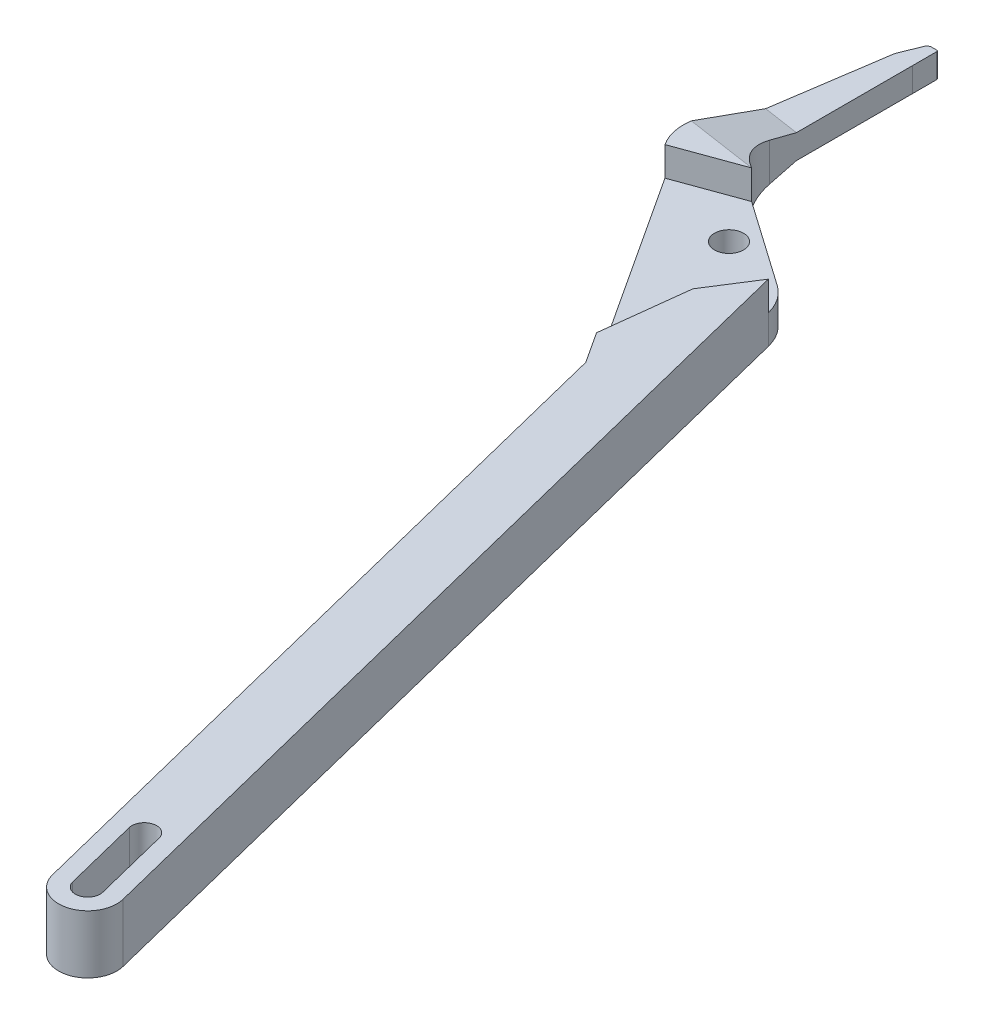
ISO-10303-21;
HEADER;
FILE_DESCRIPTION(('STEP AP214'),'2;1');
FILE_NAME('part.step','',(''),(''),'','','');
FILE_SCHEMA(('AUTOMOTIVE_DESIGN { 1 0 10303 214 1 1 1 1 }'));
ENDSEC;
DATA;
#1=APPLICATION_CONTEXT('core data for automotive mechanical design processes');
#2=APPLICATION_PROTOCOL_DEFINITION('international standard','automotive_design',2000,#1);
#3=PRODUCT_CONTEXT('',#1,'mechanical');
#4=PRODUCT('Part','Part','',(#3));
#5=PRODUCT_RELATED_PRODUCT_CATEGORY('part','',(#4));
#6=PRODUCT_DEFINITION_FORMATION('','',#4);
#7=PRODUCT_DEFINITION_CONTEXT('part definition',#1,'design');
#8=PRODUCT_DEFINITION('design','',#6,#7);
#9=PRODUCT_DEFINITION_SHAPE('','',#8);
#10=(LENGTH_UNIT() NAMED_UNIT(*) SI_UNIT(.MILLI.,.METRE.));
#11=(NAMED_UNIT(*) PLANE_ANGLE_UNIT() SI_UNIT($,.RADIAN.));
#12=(NAMED_UNIT(*) SI_UNIT($,.STERADIAN.) SOLID_ANGLE_UNIT());
#13=UNCERTAINTY_MEASURE_WITH_UNIT(LENGTH_MEASURE(1.E-05),#10,'distance_accuracy_value','');
#14=(GEOMETRIC_REPRESENTATION_CONTEXT(3) GLOBAL_UNCERTAINTY_ASSIGNED_CONTEXT((#13)) GLOBAL_UNIT_ASSIGNED_CONTEXT((#10,
#11,#12)) REPRESENTATION_CONTEXT('',''));
#15=CARTESIAN_POINT('',(0.,0.,0.));
#16=DIRECTION('',(0.,0.,1.));
#17=DIRECTION('',(1.,0.,0.));
#18=AXIS2_PLACEMENT_3D('',#15,#16,#17);
#19=CARTESIAN_POINT('',(-10.,12.,0.));
#20=DIRECTION('',(1.,0.,0.));
#21=DIRECTION('',(0.,0.,-1.));
#22=AXIS2_PLACEMENT_3D('',#19,#20,#21);
#23=PLANE('',#22);
#24=DIRECTION('',(0.,0.,1.));
#25=VECTOR('',#24,1.);
#26=CARTESIAN_POINT('',(-10.,8.5,0.));
#27=LINE('',#26,#25);
#28=CARTESIAN_POINT('',(-10.,8.49999999999999,-52.8559483259043));
#29=VERTEX_POINT('',#28);
#30=CARTESIAN_POINT('',(-10.,8.49999999999999,-47.8559483259043));
#31=VERTEX_POINT('',#30);
#32=EDGE_CURVE('E344',#29,#31,#27,.T.);
#33=ORIENTED_EDGE('',*,*,#32,.T.);
#34=DIRECTION('',(0.,-1.,0.));
#35=VECTOR('',#34,1.);
#36=CARTESIAN_POINT('',(-10.,12.,-47.8559483259043));
#37=LINE('',#36,#35);
#38=CARTESIAN_POINT('',(-10.,3.5,-47.8559483259043));
#39=VERTEX_POINT('',#38);
#40=EDGE_CURVE('E12',#31,#39,#37,.T.);
#41=ORIENTED_EDGE('',*,*,#40,.T.);
#42=DIRECTION('',(0.,0.,1.));
#43=VECTOR('',#42,1.);
#44=CARTESIAN_POINT('',(-10.,3.5,0.));
#45=LINE('',#44,#43);
#46=CARTESIAN_POINT('',(-10.,3.49999999999999,-52.8559483259043));
#47=VERTEX_POINT('',#46);
#48=EDGE_CURVE('E319',#47,#39,#45,.T.);
#49=ORIENTED_EDGE('',*,*,#48,.F.);
#50=DIRECTION('',(0.,-1.,0.));
#51=VECTOR('',#50,1.);
#52=CARTESIAN_POINT('',(-10.,12.,-52.8559483259043));
#53=LINE('',#52,#51);
#54=EDGE_CURVE('E471',#29,#47,#53,.T.);
#55=ORIENTED_EDGE('',*,*,#54,.F.);
#56=EDGE_LOOP('',(#33,#41,#49,#55));
#57=FACE_BOUND('',#56,.T.);
#58=ADVANCED_FACE('F48',(#57),#23,.T.);
#59=CARTESIAN_POINT('',(0.,12.,0.));
#60=DIRECTION('',(0.,1.,0.));
#61=DIRECTION('',(0.,0.,1.));
#62=AXIS2_PLACEMENT_3D('',#59,#60,#61);
#63=PLANE('',#62);
#64=CARTESIAN_POINT('',(55.143940196513,12.,187.354629285445));
#65=DIRECTION('',(0.,1.,0.));
#66=DIRECTION('',(0.,0.,1.));
#67=AXIS2_PLACEMENT_3D('',#64,#65,#66);
#68=CIRCLE('',#67,2.54999999999999);
#69=CARTESIAN_POINT('',(52.6696860945093,12.,187.971530119224));
#70=VERTEX_POINT('',#69);
#71=CARTESIAN_POINT('',(57.6181942985169,12.,186.737728451666));
#72=VERTEX_POINT('',#71);
#73=EDGE_CURVE('E366',#70,#72,#68,.T.);
#74=ORIENTED_EDGE('',*,*,#73,.F.);
#75=DIRECTION('',(-0.241921895599676,0.,-0.970295726275994));
#76=VECTOR('',#75,1.);
#77=CARTESIAN_POINT('',(5.46348532198055,12.,-1.36219988389249));
#78=LINE('',#77,#76);
#79=CARTESIAN_POINT('',(48.7989357649145,12.,172.446798498808));
#80=VERTEX_POINT('',#79);
#81=EDGE_CURVE('E370',#70,#80,#78,.T.);
#82=ORIENTED_EDGE('',*,*,#81,.T.);
#83=CARTESIAN_POINT('',(51.2731898669183,12.,171.829897665029));
#84=DIRECTION('',(0.,1.,0.));
#85=DIRECTION('',(0.,0.,1.));
#86=AXIS2_PLACEMENT_3D('',#83,#84,#85);
#87=CIRCLE('',#86,2.55);
#88=CARTESIAN_POINT('',(53.747443968922,12.,171.21299683125));
#89=VERTEX_POINT('',#88);
#90=EDGE_CURVE('E373',#89,#80,#87,.T.);
#91=ORIENTED_EDGE('',*,*,#90,.F.);
#92=DIRECTION('',(-0.241921895599675,0.,-0.970295726275995));
#93=VECTOR('',#92,1.);
#94=CARTESIAN_POINT('',(10.4119935259884,12.,-2.59600155145089));
#95=LINE('',#94,#93);
#96=EDGE_CURVE('E377',#72,#89,#95,.T.);
#97=ORIENTED_EDGE('',*,*,#96,.F.);
#98=EDGE_LOOP('',(#74,#82,#91,#97));
#99=FACE_BOUND('',#98,.T.);
#100=DIRECTION('',(0.241921895599669,0.,0.970295726275996));
#101=VECTOR('',#100,1.);
#102=CARTESIAN_POINT('',(13.7595137816418,12.,-3.43063209126997));
#103=LINE('',#102,#101);
#104=CARTESIAN_POINT('',(16.7667624796561,12.,8.63078364912627));
#105=VERTEX_POINT('',#104);
#106=CARTESIAN_POINT('',(60.965714554169,12.,185.903097911847));
#107=VERTEX_POINT('',#106);
#108=EDGE_CURVE('E356',#105,#107,#103,.T.);
#109=ORIENTED_EDGE('',*,*,#108,.F.);
#110=DIRECTION('',(-0.536424107849591,0.,0.843948562720365));
#111=VECTOR('',#110,1.);
#112=CARTESIAN_POINT('',(15.8493924203802,12.,10.0740691608685));
#113=LINE('',#112,#111);
#114=CARTESIAN_POINT('',(10.7120042662003,12.,18.156650248131));
#115=VERTEX_POINT('',#114);
#116=EDGE_CURVE('E521',#105,#115,#113,.T.);
#117=ORIENTED_EDGE('',*,*,#116,.T.);
#118=DIRECTION('',(0.116867877168279,0.,-0.993147471066699));
#119=VECTOR('',#118,1.);
#120=CARTESIAN_POINT('',(12.6730872230331,12.,1.49129594956684));
#121=LINE('',#120,#119);
#122=CARTESIAN_POINT('',(8.62075702087242,12.,35.9281454048542));
#123=VERTEX_POINT('',#122);
#124=EDGE_CURVE('E529',#123,#115,#121,.T.);
#125=ORIENTED_EDGE('',*,*,#124,.F.);
#126=DIRECTION('',(0.546821382180488,0.,0.837249291424138));
#127=VECTOR('',#126,1.);
#128=CARTESIAN_POINT('',(-10.4057992206616,12.,6.79619985447357));
#129=LINE('',#128,#127);
#130=CARTESIAN_POINT('',(12.8013367550779,12.,42.3291156929003));
#131=VERTEX_POINT('',#130);
#132=EDGE_CURVE('E249',#123,#131,#129,.T.);
#133=ORIENTED_EDGE('',*,*,#132,.T.);
#134=DIRECTION('',(-0.241921895599669,0.,-0.970295726275996));
#135=VECTOR('',#134,1.);
#136=CARTESIAN_POINT('',(2.11596506632979,12.,-0.527569344073948));
#137=LINE('',#136,#135);
#138=CARTESIAN_POINT('',(49.3221658388571,12.,188.806160659043));
#139=VERTEX_POINT('',#138);
#140=EDGE_CURVE('E348',#139,#131,#137,.T.);
#141=ORIENTED_EDGE('',*,*,#140,.F.);
#142=CARTESIAN_POINT('',(55.143940196513,12.,187.354629285445));
#143=DIRECTION('',(0.,1.,0.));
#144=DIRECTION('',(0.,0.,1.));
#145=AXIS2_PLACEMENT_3D('',#142,#143,#144);
#146=CIRCLE('',#145,5.99999999999999);
#147=EDGE_CURVE('E352',#139,#107,#146,.T.);
#148=ORIENTED_EDGE('',*,*,#147,.T.);
#149=EDGE_LOOP('',(#109,#117,#125,#133,#141,#148));
#150=FACE_BOUND('',#149,.T.);
#151=ADVANCED_FACE('F640',(#99,#150),#63,.T.);
#152=CARTESIAN_POINT('',(7.06380521689611,12.,11.050002605123));
#153=DIRECTION('',(0.,-1.,0.));
#154=DIRECTION('',(0.,0.,-1.));
#155=AXIS2_PLACEMENT_3D('',#152,#153,#154);
#156=CYLINDRICAL_SURFACE('',#155,10.);
#157=DIRECTION('',(0.,-1.,0.));
#158=VECTOR('',#157,1.);
#159=CARTESIAN_POINT('',(12.7995695804065,12.,2.85848216223302));
#160=LINE('',#159,#158);
#161=CARTESIAN_POINT('',(12.7995695804065,6.,2.85848216223302));
#162=VERTEX_POINT('',#161);
#163=CARTESIAN_POINT('',(12.7995695804065,0.,2.85848216223302));
#164=VERTEX_POINT('',#163);
#165=EDGE_CURVE('E484',#162,#164,#160,.T.);
#166=ORIENTED_EDGE('',*,*,#165,.F.);
#167=CARTESIAN_POINT('',(7.06380521689611,6.,11.050002605123));
#168=DIRECTION('',(0.,1.,0.));
#169=DIRECTION('',(0.,0.,1.));
#170=AXIS2_PLACEMENT_3D('',#167,#168,#169);
#171=CIRCLE('',#170,10.);
#172=CARTESIAN_POINT('',(16.7667624796561,6.,8.63078364912627));
#173=VERTEX_POINT('',#172);
#174=EDGE_CURVE('E615',#173,#162,#171,.T.);
#175=ORIENTED_EDGE('',*,*,#174,.F.);
#176=DIRECTION('',(0.,-1.,0.));
#177=VECTOR('',#176,1.);
#178=CARTESIAN_POINT('',(16.7667624796561,12.,8.63078364912627));
#179=LINE('',#178,#177);
#180=CARTESIAN_POINT('',(16.7667624796561,0.,8.63078364912627));
#181=VERTEX_POINT('',#180);
#182=EDGE_CURVE('E487',#173,#181,#179,.T.);
#183=ORIENTED_EDGE('',*,*,#182,.T.);
#184=CARTESIAN_POINT('',(7.06380521689611,0.,11.050002605123));
#185=DIRECTION('',(0.,1.,0.));
#186=DIRECTION('',(0.,0.,1.));
#187=AXIS2_PLACEMENT_3D('',#184,#185,#186);
#188=CIRCLE('',#187,10.);
#189=EDGE_CURVE('E393',#164,#181,#188,.F.);
#190=ORIENTED_EDGE('',*,*,#189,.F.);
#191=EDGE_LOOP('',(#166,#175,#183,#190));
#192=FACE_BOUND('',#191,.T.);
#193=ADVANCED_FACE('F614',(#192),#156,.T.);
#194=CARTESIAN_POINT('',(0.,12.,0.));
#195=DIRECTION('',(0.,-1.,0.));
#196=DIRECTION('',(0.,0.,-1.));
#197=AXIS2_PLACEMENT_3D('',#194,#195,#196);
#198=CYLINDRICAL_SURFACE('',#197,3.);
#199=CARTESIAN_POINT('',(0.,0.,0.));
#200=DIRECTION('',(0.,1.,0.));
#201=DIRECTION('',(0.,0.,1.));
#202=AXIS2_PLACEMENT_3D('',#199,#200,#201);
#203=CIRCLE('',#202,3.);
#204=CARTESIAN_POINT('',(0.,0.,3.));
#205=VERTEX_POINT('',#204);
#206=EDGE_CURVE('E353',#205,#205,#203,.T.);
#207=ORIENTED_EDGE('',*,*,#206,.F.);
#208=EDGE_LOOP('',(#207));
#209=FACE_BOUND('',#208,.T.);
#210=CARTESIAN_POINT('',(0.,6.,0.));
#211=DIRECTION('',(0.,1.,0.));
#212=DIRECTION('',(0.,0.,1.));
#213=AXIS2_PLACEMENT_3D('',#210,#211,#212);
#214=CIRCLE('',#213,3.);
#215=CARTESIAN_POINT('',(0.,6.,3.));
#216=VERTEX_POINT('',#215);
#217=EDGE_CURVE('E244',#216,#216,#214,.F.);
#218=ORIENTED_EDGE('',*,*,#217,.F.);
#219=EDGE_LOOP('',(#218));
#220=FACE_BOUND('',#219,.T.);
#221=ADVANCED_FACE('F681',(#209,#220),#198,.F.);
#222=CARTESIAN_POINT('',(2.86788218175522,12.,-4.09576022144498));
#223=DIRECTION('',(0.573576436351044,0.,-0.819152044288993));
#224=DIRECTION('',(-0.819152044288994,0.,-0.573576436351044));
#225=AXIS2_PLACEMENT_3D('',#222,#223,#224);
#226=PLANE('',#225);
#227=DIRECTION('',(0.,1.,0.));
#228=VECTOR('',#227,1.);
#229=CARTESIAN_POINT('',(-4.82529622795795,6.,-9.48258173671831));
#230=LINE('',#229,#228);
#231=CARTESIAN_POINT('',(-4.82529622795795,6.,-9.48258173671831));
#232=VERTEX_POINT('',#231);
#233=CARTESIAN_POINT('',(-4.82529622795795,12.,-9.48258173671831));
#234=VERTEX_POINT('',#233);
#235=EDGE_CURVE('E255',#232,#234,#230,.T.);
#236=ORIENTED_EDGE('',*,*,#235,.F.);
#237=DIRECTION('',(-0.819152044288993,0.,-0.573576436351044));
#238=VECTOR('',#237,1.);
#239=CARTESIAN_POINT('',(2.86788218175522,6.,-4.09576022144498));
#240=LINE('',#239,#238);
#241=EDGE_CURVE('E257',#162,#232,#240,.T.);
#242=ORIENTED_EDGE('',*,*,#241,.F.);
#243=ORIENTED_EDGE('',*,*,#165,.T.);
#244=DIRECTION('',(0.819152044288993,0.,0.573576436351044));
#245=VECTOR('',#244,1.);
#246=CARTESIAN_POINT('',(2.86788218175522,0.,-4.09576022144498));
#247=LINE('',#246,#245);
#248=CARTESIAN_POINT('',(-4.82529622795797,0.,-9.48258173671831));
#249=VERTEX_POINT('',#248);
#250=EDGE_CURVE('E397',#249,#164,#247,.T.);
#251=ORIENTED_EDGE('',*,*,#250,.F.);
#252=DIRECTION('',(0.813720170842053,-0.114970495134356,0.569772997616895));
#253=VECTOR('',#252,1.);
#254=CARTESIAN_POINT('',(1.64354636610422,-0.913982549081857,-4.95304938886394));
#255=LINE('',#254,#253);
#256=CARTESIAN_POINT('',(-5.7357643635104,0.128640011762514,-10.1200983885319));
#257=VERTEX_POINT('',#256);
#258=EDGE_CURVE('E288',#257,#249,#255,.T.);
#259=ORIENTED_EDGE('',*,*,#258,.F.);
#260=DIRECTION('',(0.,-1.,0.));
#261=VECTOR('',#260,1.);
#262=CARTESIAN_POINT('',(-5.7357643635104,12.,-10.1200983885319));
#263=LINE('',#262,#261);
#264=CARTESIAN_POINT('',(-5.7357643635104,11.8713599882375,-10.1200983885319));
#265=VERTEX_POINT('',#264);
#266=EDGE_CURVE('E480',#265,#257,#263,.T.);
#267=ORIENTED_EDGE('',*,*,#266,.F.);
#268=DIRECTION('',(0.813720170842053,0.114970495134356,0.569772997616895));
#269=VECTOR('',#268,1.);
#270=CARTESIAN_POINT('',(2.7661920974145,13.0726011260991,-4.16696438506153));
#271=LINE('',#270,#269);
#272=EDGE_CURVE('E299',#265,#234,#271,.T.);
#273=ORIENTED_EDGE('',*,*,#272,.T.);
#274=EDGE_LOOP('',(#236,#242,#243,#251,#259,#267,#273));
#275=FACE_BOUND('',#274,.T.);
#276=ADVANCED_FACE('F627',(#275),#226,.T.);
#277=CARTESIAN_POINT('',(0.,12.,-18.3116188314218));
#278=DIRECTION('',(0.,-1.,0.));
#279=DIRECTION('',(0.,0.,-1.));
#280=AXIS2_PLACEMENT_3D('',#277,#278,#279);
#281=CYLINDRICAL_SURFACE('',#280,10.);
#282=DIRECTION('',(0.,-1.,0.));
#283=VECTOR('',#282,1.);
#284=CARTESIAN_POINT('',(-10.,12.,-18.3116188314219));
#285=LINE('',#284,#283);
#286=CARTESIAN_POINT('',(-10.,9.93341411892296,-18.3116188314219));
#287=VERTEX_POINT('',#286);
#288=CARTESIAN_POINT('',(-10.,2.06658588107704,-18.3116188314219));
#289=VERTEX_POINT('',#288);
#290=EDGE_CURVE('E476',#287,#289,#285,.T.);
#291=ORIENTED_EDGE('',*,*,#290,.F.);
#292=CARTESIAN_POINT('',(0.,9.55001554875971,-18.3116188314218));
#293=DIRECTION('',(0.0371117096913634,0.967966825634217,-0.248320247816002));
#294=DIRECTION('',(0.143074606489986,-0.251078124239482,-0.957334545760321));
#295=AXIS2_PLACEMENT_3D('',#292,#293,#294);
#296=ELLIPSE('',#295,10.3309325641898,10.);
#297=EDGE_CURVE('E295',#287,#265,#296,.T.);
#298=ORIENTED_EDGE('',*,*,#297,.T.);
#299=ORIENTED_EDGE('',*,*,#266,.T.);
#300=CARTESIAN_POINT('',(0.,2.44998445124029,-18.3116188314218));
#301=DIRECTION('',(-0.0371117096913633,0.967966825634217,0.248320247816002));
#302=DIRECTION('',(-0.143074606489986,-0.251078124239482,0.957334545760321));
#303=AXIS2_PLACEMENT_3D('',#300,#301,#302);
#304=ELLIPSE('',#303,10.3309325641898,10.);
#305=EDGE_CURVE('E285',#289,#257,#304,.T.);
#306=ORIENTED_EDGE('',*,*,#305,.F.);
#307=EDGE_LOOP('',(#291,#298,#299,#306));
#308=FACE_BOUND('',#307,.T.);
#309=ADVANCED_FACE('F670',(#308),#281,.F.);
#310=ORIENTED_EDGE('',*,*,#40,.F.);
#311=CARTESIAN_POINT('',(-9.99999999999999,8.5,-23.8991507653511));
#312=VERTEX_POINT('',#311);
#313=EDGE_CURVE('E343',#31,#312,#27,.T.);
#314=ORIENTED_EDGE('',*,*,#313,.T.);
#315=DIRECTION('',(0.,0.248491427789073,0.968634095164603));
#316=VECTOR('',#315,1.);
#317=CARTESIAN_POINT('',(-10.,14.4685782920071,-0.633284072336638));
#318=LINE('',#317,#316);
#319=EDGE_CURVE('E291',#312,#287,#318,.T.);
#320=ORIENTED_EDGE('',*,*,#319,.T.);
#321=ORIENTED_EDGE('',*,*,#290,.T.);
#322=DIRECTION('',(0.,-0.248491427789072,0.968634095164603));
#323=VECTOR('',#322,1.);
#324=CARTESIAN_POINT('',(-10.,-1.72760241579128,-3.52165130408818));
#325=LINE('',#324,#323);
#326=CARTESIAN_POINT('',(-10.,3.5,-23.8991507653511));
#327=VERTEX_POINT('',#326);
#328=EDGE_CURVE('E273',#327,#289,#325,.T.);
#329=ORIENTED_EDGE('',*,*,#328,.F.);
#330=EDGE_CURVE('E318',#39,#327,#45,.T.);
#331=ORIENTED_EDGE('',*,*,#330,.F.);
#332=EDGE_LOOP('',(#310,#314,#320,#321,#329,#331));
#333=FACE_BOUND('',#332,.T.);
#334=ADVANCED_FACE('F660',(#333),#23,.T.);
#335=CARTESIAN_POINT('',(-10.25,12.,-52.8559483259043));
#336=DIRECTION('',(0.,-1.,0.));
#337=DIRECTION('',(0.,0.,-1.));
#338=AXIS2_PLACEMENT_3D('',#335,#336,#337);
#339=CYLINDRICAL_SURFACE('',#338,0.250000000000005);
#340=DIRECTION('',(0.,-1.,0.));
#341=VECTOR('',#340,1.);
#342=CARTESIAN_POINT('',(-10.25,12.,-53.1059483259043));
#343=LINE('',#342,#341);
#344=CARTESIAN_POINT('',(-10.25,8.49999999999999,-53.1059483259043));
#345=VERTEX_POINT('',#344);
#346=CARTESIAN_POINT('',(-10.25,3.49999999999999,-53.1059483259043));
#347=VERTEX_POINT('',#346);
#348=EDGE_CURVE('E468',#345,#347,#343,.T.);
#349=ORIENTED_EDGE('',*,*,#348,.F.);
#350=CARTESIAN_POINT('',(-10.25,8.49999999999999,-52.8559483259043));
#351=DIRECTION('',(0.,1.,0.));
#352=DIRECTION('',(0.,0.,1.));
#353=AXIS2_PLACEMENT_3D('',#350,#351,#352);
#354=CIRCLE('',#353,0.250000000000005);
#355=EDGE_CURVE('E339',#345,#29,#354,.F.);
#356=ORIENTED_EDGE('',*,*,#355,.T.);
#357=ORIENTED_EDGE('',*,*,#54,.T.);
#358=CARTESIAN_POINT('',(-10.25,3.49999999999999,-52.8559483259043));
#359=DIRECTION('',(0.,1.,0.));
#360=DIRECTION('',(0.,0.,1.));
#361=AXIS2_PLACEMENT_3D('',#358,#359,#360);
#362=CIRCLE('',#361,0.250000000000005);
#363=EDGE_CURVE('E315',#347,#47,#362,.F.);
#364=ORIENTED_EDGE('',*,*,#363,.F.);
#365=EDGE_LOOP('',(#349,#356,#357,#364));
#366=FACE_BOUND('',#365,.T.);
#367=ADVANCED_FACE('F669',(#366),#339,.T.);
#368=CARTESIAN_POINT('',(-1.03031088892501E-12,12.,-53.1059483259045));
#369=DIRECTION('',(0.,0.,-1.));
#370=DIRECTION('',(-1.,0.,0.));
#371=AXIS2_PLACEMENT_3D('',#368,#369,#370);
#372=PLANE('',#371);
#373=DIRECTION('',(0.,-1.,0.));
#374=VECTOR('',#373,1.);
#375=CARTESIAN_POINT('',(-11.3229670385731,12.,-53.1059483259043));
#376=LINE('',#375,#374);
#377=CARTESIAN_POINT('',(-11.3229670385731,8.49999999999999,-53.1059483259043));
#378=VERTEX_POINT('',#377);
#379=CARTESIAN_POINT('',(-11.3229670385731,3.49999999999999,-53.1059483259043));
#380=VERTEX_POINT('',#379);
#381=EDGE_CURVE('E464',#378,#380,#376,.T.);
#382=ORIENTED_EDGE('',*,*,#381,.F.);
#383=DIRECTION('',(1.,0.,0.));
#384=VECTOR('',#383,1.);
#385=CARTESIAN_POINT('',(-1.03038781146164E-12,8.49999999999999,-53.1059483259045));
#386=LINE('',#385,#384);
#387=EDGE_CURVE('E335',#378,#345,#386,.T.);
#388=ORIENTED_EDGE('',*,*,#387,.T.);
#389=ORIENTED_EDGE('',*,*,#348,.T.);
#390=DIRECTION('',(1.,0.,0.));
#391=VECTOR('',#390,1.);
#392=CARTESIAN_POINT('',(-1.03046656548725E-12,3.49999999999999,-53.1059483259045));
#393=LINE('',#392,#391);
#394=EDGE_CURVE('E312',#380,#347,#393,.T.);
#395=ORIENTED_EDGE('',*,*,#394,.F.);
#396=EDGE_LOOP('',(#382,#388,#389,#395));
#397=FACE_BOUND('',#396,.T.);
#398=ADVANCED_FACE('F675',(#397),#372,.T.);
#399=CARTESIAN_POINT('',(-11.3229670385731,12.,-52.1059483259043));
#400=DIRECTION('',(0.,-1.,0.));
#401=DIRECTION('',(0.,0.,-1.));
#402=AXIS2_PLACEMENT_3D('',#399,#400,#401);
#403=CYLINDRICAL_SURFACE('',#402,0.999999999999995);
#404=DIRECTION('',(0.,-1.,0.));
#405=VECTOR('',#404,1.);
#406=CARTESIAN_POINT('',(-12.2514437294584,12.,-52.4773390022584));
#407=LINE('',#406,#405);
#408=CARTESIAN_POINT('',(-12.2514437294584,8.49999999999999,-52.4773390022584));
#409=VERTEX_POINT('',#408);
#410=CARTESIAN_POINT('',(-12.2514437294584,3.49999999999999,-52.4773390022584));
#411=VERTEX_POINT('',#410);
#412=EDGE_CURVE('E460',#409,#411,#407,.T.);
#413=ORIENTED_EDGE('',*,*,#412,.F.);
#414=CARTESIAN_POINT('',(-11.3229670385731,8.49999999999999,-52.1059483259043));
#415=DIRECTION('',(0.,1.,0.));
#416=DIRECTION('',(0.,0.,1.));
#417=AXIS2_PLACEMENT_3D('',#414,#415,#416);
#418=CIRCLE('',#417,0.999999999999995);
#419=EDGE_CURVE('E331',#409,#378,#418,.F.);
#420=ORIENTED_EDGE('',*,*,#419,.T.);
#421=ORIENTED_EDGE('',*,*,#381,.T.);
#422=CARTESIAN_POINT('',(-11.3229670385731,3.49999999999999,-52.1059483259043));
#423=DIRECTION('',(0.,1.,0.));
#424=DIRECTION('',(0.,0.,1.));
#425=AXIS2_PLACEMENT_3D('',#422,#423,#424);
#426=CIRCLE('',#425,0.999999999999995);
#427=EDGE_CURVE('E309',#411,#380,#426,.F.);
#428=ORIENTED_EDGE('',*,*,#427,.F.);
#429=EDGE_LOOP('',(#413,#420,#421,#428));
#430=FACE_BOUND('',#429,.T.);
#431=ADVANCED_FACE('F733',(#430),#403,.T.);
#432=CARTESIAN_POINT('',(-28.6572235606567,12.,-11.4628894242627));
#433=DIRECTION('',(-0.928476690885259,0.,-0.371390676354104));
#434=DIRECTION('',(-0.371390676354104,0.,0.928476690885259));
#435=AXIS2_PLACEMENT_3D('',#432,#433,#434);
#436=PLANE('',#435);
#437=DIRECTION('',(0.,-1.,0.));
#438=VECTOR('',#437,1.);
#439=CARTESIAN_POINT('',(-13.8700865923136,12.,-48.4307318451203));
#440=LINE('',#439,#438);
#441=CARTESIAN_POINT('',(-13.8700865923136,8.49999999999999,-48.4307318451203));
#442=VERTEX_POINT('',#441);
#443=CARTESIAN_POINT('',(-13.8700865923136,3.5,-48.4307318451203));
#444=VERTEX_POINT('',#443);
#445=EDGE_CURVE('E456',#442,#444,#440,.T.);
#446=ORIENTED_EDGE('',*,*,#445,.F.);
#447=DIRECTION('',(0.371390676354104,0.,-0.928476690885259));
#448=VECTOR('',#447,1.);
#449=CARTESIAN_POINT('',(-28.6572235606567,8.5,-11.4628894242627));
#450=LINE('',#449,#448);
#451=EDGE_CURVE('E327',#442,#409,#450,.T.);
#452=ORIENTED_EDGE('',*,*,#451,.T.);
#453=ORIENTED_EDGE('',*,*,#412,.T.);
#454=DIRECTION('',(0.371390676354104,0.,-0.928476690885259));
#455=VECTOR('',#454,1.);
#456=CARTESIAN_POINT('',(-28.6572235606567,3.5,-11.4628894242627));
#457=LINE('',#456,#455);
#458=EDGE_CURVE('E306',#444,#411,#457,.T.);
#459=ORIENTED_EDGE('',*,*,#458,.F.);
#460=EDGE_LOOP('',(#446,#452,#453,#459));
#461=FACE_BOUND('',#460,.T.);
#462=ADVANCED_FACE('F729',(#461),#436,.T.);
#463=CARTESIAN_POINT('',(-11.0846565196579,12.,-47.3165598160579));
#464=DIRECTION('',(0.,-1.,0.));
#465=DIRECTION('',(0.,0.,-1.));
#466=AXIS2_PLACEMENT_3D('',#463,#464,#465);
#467=CYLINDRICAL_SURFACE('',#466,3.00000000000001);
#468=DIRECTION('',(0.,-1.,0.));
#469=VECTOR('',#468,1.);
#470=CARTESIAN_POINT('',(-14.0517041097436,12.,-47.7599880494468));
#471=LINE('',#470,#469);
#472=CARTESIAN_POINT('',(-14.0517041097436,8.49999999999999,-47.7599880494468));
#473=VERTEX_POINT('',#472);
#474=CARTESIAN_POINT('',(-14.0517041097436,3.5,-47.7599880494468));
#475=VERTEX_POINT('',#474);
#476=EDGE_CURVE('E452',#473,#475,#471,.T.);
#477=ORIENTED_EDGE('',*,*,#476,.F.);
#478=CARTESIAN_POINT('',(-11.0846565196579,8.49999999999999,-47.3165598160579));
#479=DIRECTION('',(0.,1.,0.));
#480=DIRECTION('',(0.,0.,1.));
#481=AXIS2_PLACEMENT_3D('',#478,#479,#480);
#482=CIRCLE('',#481,3.00000000000001);
#483=EDGE_CURVE('E323',#473,#442,#482,.F.);
#484=ORIENTED_EDGE('',*,*,#483,.T.);
#485=ORIENTED_EDGE('',*,*,#445,.T.);
#486=CARTESIAN_POINT('',(-11.0846565196579,3.5,-47.3165598160579));
#487=DIRECTION('',(0.,1.,0.));
#488=DIRECTION('',(0.,0.,1.));
#489=AXIS2_PLACEMENT_3D('',#486,#487,#488);
#490=CIRCLE('',#489,3.00000000000001);
#491=EDGE_CURVE('E303',#475,#444,#490,.F.);
#492=ORIENTED_EDGE('',*,*,#491,.F.);
#493=EDGE_LOOP('',(#477,#484,#485,#492));
#494=FACE_BOUND('',#493,.T.);
#495=ADVANCED_FACE('F726',(#494),#467,.T.);
#496=CARTESIAN_POINT('',(-20.7265423514152,12.,-3.09760250892397));
#497=DIRECTION('',(-0.989015863361918,0.,-0.147809411129604));
#498=DIRECTION('',(-0.147809411129604,0.,0.989015863361918));
#499=AXIS2_PLACEMENT_3D('',#496,#497,#498);
#500=PLANE('',#499);
#501=DIRECTION('',(0.143074606489986,-0.251078124239482,-0.957334545760321));
#502=VECTOR('',#501,1.);
#503=CARTESIAN_POINT('',(-20.2147257092288,13.3494666390775,-6.52224762716469));
#504=LINE('',#503,#502);
#505=CARTESIAN_POINT('',(-19.4457443057624,12.,-11.667622342119));
#506=VERTEX_POINT('',#505);
#507=CARTESIAN_POINT('',(-17.4513008462545,8.5,-25.0127551381774));
#508=VERTEX_POINT('',#507);
#509=EDGE_CURVE('E265',#506,#508,#504,.T.);
#510=ORIENTED_EDGE('',*,*,#509,.T.);
#511=DIRECTION('',(0.147809411129604,0.,-0.989015863361918));
#512=VECTOR('',#511,1.);
#513=CARTESIAN_POINT('',(-20.7265423514153,8.5,-3.09760250892398));
#514=LINE('',#513,#512);
#515=EDGE_CURVE('E261',#508,#473,#514,.T.);
#516=ORIENTED_EDGE('',*,*,#515,.T.);
#517=ORIENTED_EDGE('',*,*,#476,.T.);
#518=DIRECTION('',(0.147809411129604,0.,-0.989015863361918));
#519=VECTOR('',#518,1.);
#520=CARTESIAN_POINT('',(-20.7265423514153,3.5,-3.09760250892398));
#521=LINE('',#520,#519);
#522=CARTESIAN_POINT('',(-17.4513008462545,3.5,-25.0127551381774));
#523=VERTEX_POINT('',#522);
#524=EDGE_CURVE('E278',#523,#475,#521,.T.);
#525=ORIENTED_EDGE('',*,*,#524,.F.);
#526=DIRECTION('',(0.143074606489986,0.251078124239482,-0.95733454576032));
#527=VECTOR('',#526,1.);
#528=CARTESIAN_POINT('',(-20.6458005551145,-2.10594933273693,-3.6378584829348));
#529=LINE('',#528,#527);
#530=CARTESIAN_POINT('',(-19.4457443057624,0.,-11.667622342119));
#531=VERTEX_POINT('',#530);
#532=EDGE_CURVE('E274',#531,#523,#529,.T.);
#533=ORIENTED_EDGE('',*,*,#532,.F.);
#534=DIRECTION('',(0.,-1.,0.));
#535=VECTOR('',#534,1.);
#536=CARTESIAN_POINT('',(-19.4457443057624,12.,-11.667622342119));
#537=LINE('',#536,#535);
#538=EDGE_CURVE('E448',#506,#531,#537,.T.);
#539=ORIENTED_EDGE('',*,*,#538,.F.);
#540=EDGE_LOOP('',(#510,#516,#517,#525,#533,#539));
#541=FACE_BOUND('',#540,.T.);
#542=ADVANCED_FACE('F511',(#541),#500,.T.);
#543=DIRECTION('',(-0.93987128461166,0.,0.34152886900294));
#544=VECTOR('',#543,1.);
#545=CARTESIAN_POINT('',(-3.60667608629169,12.,-9.92540190320467));
#546=LINE('',#545,#544);
#547=CARTESIAN_POINT('',(-17.9280785863846,12.,-4.72131440901809));
#548=VERTEX_POINT('',#547);
#549=EDGE_CURVE('E507',#234,#548,#546,.T.);
#550=ORIENTED_EDGE('',*,*,#549,.F.);
#551=DIRECTION('',(-0.989015863361918,0.,-0.147809411129604));
#552=VECTOR('',#551,1.);
#553=CARTESIAN_POINT('',(1.28079804565283,12.,-8.57001983319504));
#554=LINE('',#553,#552);
#555=EDGE_CURVE('E57',#234,#506,#554,.T.);
#556=ORIENTED_EDGE('',*,*,#555,.T.);
#557=CARTESIAN_POINT('',(-9.55558567214323,12.,-10.189528230823));
#558=DIRECTION('',(0.,1.,0.));
#559=DIRECTION('',(0.,0.,1.));
#560=AXIS2_PLACEMENT_3D('',#557,#558,#559);
#561=CIRCLE('',#560,10.);
#562=EDGE_CURVE('E360',#548,#506,#561,.F.);
#563=ORIENTED_EDGE('',*,*,#562,.F.);
#564=EDGE_LOOP('',(#550,#556,#563));
#565=FACE_BOUND('',#564,.T.);
#566=ADVANCED_FACE('F506',(#565),#63,.T.);
#567=CARTESIAN_POINT('',(55.143940196513,12.,187.354629285445));
#568=DIRECTION('',(0.,-1.,0.));
#569=DIRECTION('',(0.,0.,-1.));
#570=AXIS2_PLACEMENT_3D('',#567,#568,#569);
#571=CYLINDRICAL_SURFACE('',#570,2.54999999999999);
#572=CARTESIAN_POINT('',(55.143940196513,0.,187.354629285445));
#573=DIRECTION('',(0.,1.,0.));
#574=DIRECTION('',(0.,0.,1.));
#575=AXIS2_PLACEMENT_3D('',#572,#573,#574);
#576=CIRCLE('',#575,2.54999999999999);
#577=CARTESIAN_POINT('',(52.6696860945093,0.,187.971530119224));
#578=VERTEX_POINT('',#577);
#579=CARTESIAN_POINT('',(57.6181942985169,0.,186.737728451666));
#580=VERTEX_POINT('',#579);
#581=EDGE_CURVE('E409',#578,#580,#576,.T.);
#582=ORIENTED_EDGE('',*,*,#581,.F.);
#583=DIRECTION('',(0.,-1.,0.));
#584=VECTOR('',#583,1.);
#585=CARTESIAN_POINT('',(52.6696860945093,12.,187.971530119224));
#586=LINE('',#585,#584);
#587=EDGE_CURVE('E438',#70,#578,#586,.T.);
#588=ORIENTED_EDGE('',*,*,#587,.F.);
#589=ORIENTED_EDGE('',*,*,#73,.T.);
#590=DIRECTION('',(0.,-1.,0.));
#591=VECTOR('',#590,1.);
#592=CARTESIAN_POINT('',(57.6181942985169,12.,186.737728451666));
#593=LINE('',#592,#591);
#594=EDGE_CURVE('E428',#72,#580,#593,.T.);
#595=ORIENTED_EDGE('',*,*,#594,.T.);
#596=EDGE_LOOP('',(#582,#588,#589,#595));
#597=FACE_BOUND('',#596,.T.);
#598=ADVANCED_FACE('F709',(#597),#571,.F.);
#599=CARTESIAN_POINT('',(5.46348532198055,12.,-1.36219988389249));
#600=DIRECTION('',(-0.970295726275994,0.,0.241921895599676));
#601=DIRECTION('',(0.241921895599676,0.,0.970295726275994));
#602=AXIS2_PLACEMENT_3D('',#599,#600,#601);
#603=PLANE('',#602);
#604=DIRECTION('',(-0.241921895599676,0.,-0.970295726275994));
#605=VECTOR('',#604,1.);
#606=CARTESIAN_POINT('',(5.46348532198055,0.,-1.36219988389249));
#607=LINE('',#606,#605);
#608=CARTESIAN_POINT('',(48.7989357649145,0.,172.446798498808));
#609=VERTEX_POINT('',#608);
#610=EDGE_CURVE('E413',#578,#609,#607,.T.);
#611=ORIENTED_EDGE('',*,*,#610,.T.);
#612=DIRECTION('',(0.,-1.,0.));
#613=VECTOR('',#612,1.);
#614=CARTESIAN_POINT('',(48.7989357649145,12.,172.446798498808));
#615=LINE('',#614,#613);
#616=EDGE_CURVE('E435',#80,#609,#615,.T.);
#617=ORIENTED_EDGE('',*,*,#616,.F.);
#618=ORIENTED_EDGE('',*,*,#81,.F.);
#619=ORIENTED_EDGE('',*,*,#587,.T.);
#620=EDGE_LOOP('',(#611,#617,#618,#619));
#621=FACE_BOUND('',#620,.T.);
#622=ADVANCED_FACE('F703',(#621),#603,.F.);
#623=CARTESIAN_POINT('',(51.2731898669183,12.,171.829897665029));
#624=DIRECTION('',(0.,-1.,0.));
#625=DIRECTION('',(0.,0.,-1.));
#626=AXIS2_PLACEMENT_3D('',#623,#624,#625);
#627=CYLINDRICAL_SURFACE('',#626,2.55);
#628=CARTESIAN_POINT('',(51.2731898669183,0.,171.829897665029));
#629=DIRECTION('',(0.,1.,0.));
#630=DIRECTION('',(0.,0.,1.));
#631=AXIS2_PLACEMENT_3D('',#628,#629,#630);
#632=CIRCLE('',#631,2.55);
#633=CARTESIAN_POINT('',(53.747443968922,0.,171.21299683125));
#634=VERTEX_POINT('',#633);
#635=EDGE_CURVE('E417',#634,#609,#632,.T.);
#636=ORIENTED_EDGE('',*,*,#635,.F.);
#637=DIRECTION('',(0.,-1.,0.));
#638=VECTOR('',#637,1.);
#639=CARTESIAN_POINT('',(53.747443968922,12.,171.21299683125));
#640=LINE('',#639,#638);
#641=EDGE_CURVE('E431',#89,#634,#640,.T.);
#642=ORIENTED_EDGE('',*,*,#641,.F.);
#643=ORIENTED_EDGE('',*,*,#90,.T.);
#644=ORIENTED_EDGE('',*,*,#616,.T.);
#645=EDGE_LOOP('',(#636,#642,#643,#644));
#646=FACE_BOUND('',#645,.T.);
#647=ADVANCED_FACE('F694',(#646),#627,.F.);
#648=CARTESIAN_POINT('',(2.11596506632979,12.,-0.527569344073948));
#649=DIRECTION('',(-0.970295726275996,0.,0.241921895599669));
#650=DIRECTION('',(0.241921895599669,0.,0.970295726275996));
#651=AXIS2_PLACEMENT_3D('',#648,#649,#650);
#652=PLANE('',#651);
#653=DIRECTION('',(-0.241921895599669,0.,-0.970295726275996));
#654=VECTOR('',#653,1.);
#655=CARTESIAN_POINT('',(2.11596506632979,0.,-0.527569344073948));
#656=LINE('',#655,#654);
#657=CARTESIAN_POINT('',(49.3221658388571,0.,188.806160659043));
#658=VERTEX_POINT('',#657);
#659=CARTESIAN_POINT('',(12.8013367550779,0.,42.3291156929003));
#660=VERTEX_POINT('',#659);
#661=EDGE_CURVE('E347',#658,#660,#656,.T.);
#662=ORIENTED_EDGE('',*,*,#661,.F.);
#663=DIRECTION('',(0.,-1.,0.));
#664=VECTOR('',#663,1.);
#665=CARTESIAN_POINT('',(49.3221658388571,12.,188.806160659043));
#666=LINE('',#665,#664);
#667=EDGE_CURVE('E432',#139,#658,#666,.T.);
#668=ORIENTED_EDGE('',*,*,#667,.F.);
#669=ORIENTED_EDGE('',*,*,#140,.T.);
#670=DIRECTION('',(0.,-1.,0.));
#671=VECTOR('',#670,1.);
#672=CARTESIAN_POINT('',(12.8013367550779,12.,42.3291156929003));
#673=LINE('',#672,#671);
#674=EDGE_CURVE('E381',#131,#660,#673,.T.);
#675=ORIENTED_EDGE('',*,*,#674,.T.);
#676=EDGE_LOOP('',(#662,#668,#669,#675));
#677=FACE_BOUND('',#676,.T.);
#678=ADVANCED_FACE('F50',(#677),#652,.T.);
#679=CARTESIAN_POINT('',(55.143940196513,12.,187.354629285445));
#680=DIRECTION('',(0.,-1.,0.));
#681=DIRECTION('',(0.,0.,-1.));
#682=AXIS2_PLACEMENT_3D('',#679,#680,#681);
#683=CYLINDRICAL_SURFACE('',#682,5.99999999999999);
#684=CARTESIAN_POINT('',(55.143940196513,0.,187.354629285445));
#685=DIRECTION('',(0.,1.,0.));
#686=DIRECTION('',(0.,0.,1.));
#687=AXIS2_PLACEMENT_3D('',#684,#685,#686);
#688=CIRCLE('',#687,5.99999999999999);
#689=CARTESIAN_POINT('',(60.965714554169,0.,185.903097911847));
#690=VERTEX_POINT('',#689);
#691=EDGE_CURVE('E385',#658,#690,#688,.T.);
#692=ORIENTED_EDGE('',*,*,#691,.T.);
#693=DIRECTION('',(0.,-1.,0.));
#694=VECTOR('',#693,1.);
#695=CARTESIAN_POINT('',(60.965714554169,12.,185.903097911847));
#696=LINE('',#695,#694);
#697=EDGE_CURVE('E491',#107,#690,#696,.T.);
#698=ORIENTED_EDGE('',*,*,#697,.F.);
#699=ORIENTED_EDGE('',*,*,#147,.F.);
#700=ORIENTED_EDGE('',*,*,#667,.T.);
#701=EDGE_LOOP('',(#692,#698,#699,#700));
#702=FACE_BOUND('',#701,.T.);
#703=ADVANCED_FACE('F688',(#702),#683,.T.);
#704=CARTESIAN_POINT('',(13.7595137816418,12.,-3.43063209126997));
#705=DIRECTION('',(0.970295726275996,0.,-0.241921895599669));
#706=DIRECTION('',(-0.241921895599669,0.,-0.970295726275996));
#707=AXIS2_PLACEMENT_3D('',#704,#705,#706);
#708=PLANE('',#707);
#709=DIRECTION('',(0.241921895599669,0.,0.970295726275996));
#710=VECTOR('',#709,1.);
#711=CARTESIAN_POINT('',(13.7595137816418,0.,-3.43063209126997));
#712=LINE('',#711,#710);
#713=EDGE_CURVE('E389',#181,#690,#712,.T.);
#714=ORIENTED_EDGE('',*,*,#713,.F.);
#715=ORIENTED_EDGE('',*,*,#182,.F.);
#716=EDGE_CURVE('E488',#105,#173,#179,.T.);
#717=ORIENTED_EDGE('',*,*,#716,.F.);
#718=ORIENTED_EDGE('',*,*,#108,.T.);
#719=ORIENTED_EDGE('',*,*,#697,.T.);
#720=EDGE_LOOP('',(#714,#715,#717,#718,#719));
#721=FACE_BOUND('',#720,.T.);
#722=ADVANCED_FACE('F618',(#721),#708,.T.);
#723=CARTESIAN_POINT('',(-9.55558567214323,12.,-10.189528230823));
#724=DIRECTION('',(0.,-1.,0.));
#725=DIRECTION('',(0.,0.,-1.));
#726=AXIS2_PLACEMENT_3D('',#723,#724,#725);
#727=CYLINDRICAL_SURFACE('',#726,10.);
#728=CARTESIAN_POINT('',(-9.55558567214323,0.,-10.189528230823));
#729=DIRECTION('',(0.,1.,0.));
#730=DIRECTION('',(0.,0.,1.));
#731=AXIS2_PLACEMENT_3D('',#728,#729,#730);
#732=CIRCLE('',#731,10.);
#733=CARTESIAN_POINT('',(-17.9280785863846,0.,-4.72131440901809));
#734=VERTEX_POINT('',#733);
#735=EDGE_CURVE('E401',#734,#531,#732,.F.);
#736=ORIENTED_EDGE('',*,*,#735,.F.);
#737=DIRECTION('',(0.,-1.,0.));
#738=VECTOR('',#737,1.);
#739=CARTESIAN_POINT('',(-17.9280785863846,12.,-4.72131440901809));
#740=LINE('',#739,#738);
#741=CARTESIAN_POINT('',(-17.9280785863846,6.,-4.72131440901809));
#742=VERTEX_POINT('',#741);
#743=EDGE_CURVE('E444',#742,#734,#740,.T.);
#744=ORIENTED_EDGE('',*,*,#743,.F.);
#745=EDGE_CURVE('E445',#548,#742,#740,.T.);
#746=ORIENTED_EDGE('',*,*,#745,.F.);
#747=ORIENTED_EDGE('',*,*,#562,.T.);
#748=ORIENTED_EDGE('',*,*,#538,.T.);
#749=EDGE_LOOP('',(#736,#744,#746,#747,#748));
#750=FACE_BOUND('',#749,.T.);
#751=ADVANCED_FACE('F516',(#750),#727,.T.);
#752=CARTESIAN_POINT('',(10.4119935259884,12.,-2.59600155145089));
#753=DIRECTION('',(-0.970295726275995,0.,0.241921895599675));
#754=DIRECTION('',(0.241921895599675,0.,0.970295726275995));
#755=AXIS2_PLACEMENT_3D('',#752,#753,#754);
#756=PLANE('',#755);
#757=DIRECTION('',(-0.241921895599675,0.,-0.970295726275995));
#758=VECTOR('',#757,1.);
#759=CARTESIAN_POINT('',(10.4119935259884,0.,-2.59600155145089));
#760=LINE('',#759,#758);
#761=EDGE_CURVE('E421',#580,#634,#760,.T.);
#762=ORIENTED_EDGE('',*,*,#761,.F.);
#763=ORIENTED_EDGE('',*,*,#594,.F.);
#764=ORIENTED_EDGE('',*,*,#96,.T.);
#765=ORIENTED_EDGE('',*,*,#641,.T.);
#766=EDGE_LOOP('',(#762,#763,#764,#765));
#767=FACE_BOUND('',#766,.T.);
#768=ADVANCED_FACE('F714',(#767),#756,.T.);
#769=CARTESIAN_POINT('',(-10.4057992206616,12.,6.79619985447357));
#770=DIRECTION('',(0.837249291424138,0.,-0.546821382180488));
#771=DIRECTION('',(-0.546821382180488,0.,-0.837249291424138));
#772=AXIS2_PLACEMENT_3D('',#769,#770,#771);
#773=PLANE('',#772);
#774=ORIENTED_EDGE('',*,*,#132,.F.);
#775=DIRECTION('',(0.,1.,0.));
#776=VECTOR('',#775,1.);
#777=CARTESIAN_POINT('',(8.62075702087242,6.,35.9281454048542));
#778=LINE('',#777,#776);
#779=CARTESIAN_POINT('',(8.62075702087242,6.,35.9281454048542));
#780=VERTEX_POINT('',#779);
#781=EDGE_CURVE('E227',#780,#123,#778,.T.);
#782=ORIENTED_EDGE('',*,*,#781,.F.);
#783=DIRECTION('',(0.546821382180488,0.,0.837249291424138));
#784=VECTOR('',#783,1.);
#785=CARTESIAN_POINT('',(-10.4057992206616,6.,6.79619985447357));
#786=LINE('',#785,#784);
#787=EDGE_CURVE('E234',#742,#780,#786,.T.);
#788=ORIENTED_EDGE('',*,*,#787,.F.);
#789=ORIENTED_EDGE('',*,*,#743,.T.);
#790=DIRECTION('',(0.546821382180488,0.,0.837249291424138));
#791=VECTOR('',#790,1.);
#792=CARTESIAN_POINT('',(-10.4057992206616,0.,6.79619985447357));
#793=LINE('',#792,#791);
#794=EDGE_CURVE('E405',#734,#660,#793,.T.);
#795=ORIENTED_EDGE('',*,*,#794,.T.);
#796=ORIENTED_EDGE('',*,*,#674,.F.);
#797=EDGE_LOOP('',(#774,#782,#788,#789,#795,#796));
#798=FACE_BOUND('',#797,.T.);
#799=ADVANCED_FACE('F247',(#798),#773,.F.);
#800=CARTESIAN_POINT('',(0.,0.,0.));
#801=DIRECTION('',(0.,1.,0.));
#802=DIRECTION('',(0.,0.,1.));
#803=AXIS2_PLACEMENT_3D('',#800,#801,#802);
#804=PLANE('',#803);
#805=ORIENTED_EDGE('',*,*,#735,.T.);
#806=DIRECTION('',(0.989015863361918,0.,0.147809411129604));
#807=VECTOR('',#806,1.);
#808=CARTESIAN_POINT('',(1.28079804565283,0.,-8.57001983319504));
#809=LINE('',#808,#807);
#810=EDGE_CURVE('E441',#531,#249,#809,.T.);
#811=ORIENTED_EDGE('',*,*,#810,.T.);
#812=ORIENTED_EDGE('',*,*,#250,.T.);
#813=ORIENTED_EDGE('',*,*,#189,.T.);
#814=ORIENTED_EDGE('',*,*,#713,.T.);
#815=ORIENTED_EDGE('',*,*,#691,.F.);
#816=ORIENTED_EDGE('',*,*,#661,.T.);
#817=ORIENTED_EDGE('',*,*,#794,.F.);
#818=EDGE_LOOP('',(#805,#811,#812,#813,#814,#815,#816,#817));
#819=FACE_BOUND('',#818,.T.);
#820=ORIENTED_EDGE('',*,*,#581,.T.);
#821=ORIENTED_EDGE('',*,*,#761,.T.);
#822=ORIENTED_EDGE('',*,*,#635,.T.);
#823=ORIENTED_EDGE('',*,*,#610,.F.);
#824=EDGE_LOOP('',(#820,#821,#822,#823));
#825=FACE_BOUND('',#824,.T.);
#826=ORIENTED_EDGE('',*,*,#206,.T.);
#827=EDGE_LOOP('',(#826));
#828=FACE_BOUND('',#827,.T.);
#829=ADVANCED_FACE('F622',(#819,#825,#828),#804,.F.);
#830=CARTESIAN_POINT('',(88.1545435887877,-2.10594933273693,12.6224618965004));
#831=DIRECTION('',(-0.0371117096913633,0.967966825634217,0.248320247816002));
#832=DIRECTION('',(0.,-0.248491427789072,0.968634095164603));
#833=AXIS2_PLACEMENT_3D('',#830,#831,#832);
#834=PLANE('',#833);
#835=ORIENTED_EDGE('',*,*,#258,.T.);
#836=ORIENTED_EDGE('',*,*,#810,.F.);
#837=ORIENTED_EDGE('',*,*,#532,.T.);
#838=DIRECTION('',(-0.989015863361918,0.,-0.147809411129604));
#839=VECTOR('',#838,1.);
#840=CARTESIAN_POINT('',(91.3490432976477,3.5,-8.75243475874221));
#841=LINE('',#840,#839);
#842=EDGE_CURVE('E266',#327,#523,#841,.T.);
#843=ORIENTED_EDGE('',*,*,#842,.F.);
#844=ORIENTED_EDGE('',*,*,#328,.T.);
#845=ORIENTED_EDGE('',*,*,#305,.T.);
#846=EDGE_LOOP('',(#835,#836,#837,#843,#844,#845));
#847=FACE_BOUND('',#846,.T.);
#848=ADVANCED_FACE('F760',(#847),#834,.F.);
#849=CARTESIAN_POINT('',(88.073801792487,3.5,13.1627178705112));
#850=DIRECTION('',(0.,1.,0.));
#851=DIRECTION('',(0.,0.,1.));
#852=AXIS2_PLACEMENT_3D('',#849,#850,#851);
#853=PLANE('',#852);
#854=ORIENTED_EDGE('',*,*,#48,.T.);
#855=ORIENTED_EDGE('',*,*,#330,.T.);
#856=ORIENTED_EDGE('',*,*,#842,.T.);
#857=ORIENTED_EDGE('',*,*,#524,.T.);
#858=ORIENTED_EDGE('',*,*,#491,.T.);
#859=ORIENTED_EDGE('',*,*,#458,.T.);
#860=ORIENTED_EDGE('',*,*,#427,.T.);
#861=ORIENTED_EDGE('',*,*,#394,.T.);
#862=ORIENTED_EDGE('',*,*,#363,.T.);
#863=EDGE_LOOP('',(#854,#855,#856,#857,#858,#859,#860,#861,#862));
#864=FACE_BOUND('',#863,.T.);
#865=ADVANCED_FACE('F756',(#864),#853,.F.);
#866=CARTESIAN_POINT('',(88.073801792487,8.5,13.1627178705112));
#867=DIRECTION('',(0.,1.,0.));
#868=DIRECTION('',(0.,0.,1.));
#869=AXIS2_PLACEMENT_3D('',#866,#867,#868);
#870=PLANE('',#869);
#871=ORIENTED_EDGE('',*,*,#355,.F.);
#872=ORIENTED_EDGE('',*,*,#387,.F.);
#873=ORIENTED_EDGE('',*,*,#419,.F.);
#874=ORIENTED_EDGE('',*,*,#451,.F.);
#875=ORIENTED_EDGE('',*,*,#483,.F.);
#876=ORIENTED_EDGE('',*,*,#515,.F.);
#877=DIRECTION('',(-0.989015863361918,0.,-0.147809411129604));
#878=VECTOR('',#877,1.);
#879=CARTESIAN_POINT('',(91.3490432976477,8.5,-8.75243475874221));
#880=LINE('',#879,#878);
#881=EDGE_CURVE('E270',#312,#508,#880,.T.);
#882=ORIENTED_EDGE('',*,*,#881,.F.);
#883=ORIENTED_EDGE('',*,*,#313,.F.);
#884=ORIENTED_EDGE('',*,*,#32,.F.);
#885=EDGE_LOOP('',(#871,#872,#873,#874,#875,#876,#882,#883,#884));
#886=FACE_BOUND('',#885,.T.);
#887=ADVANCED_FACE('F748',(#886),#870,.T.);
#888=CARTESIAN_POINT('',(88.5856184346734,13.3494666390775,9.73807275227047));
#889=DIRECTION('',(0.0371117096913634,0.967966825634217,-0.248320247816002));
#890=DIRECTION('',(0.,0.248491427789073,0.968634095164603));
#891=AXIS2_PLACEMENT_3D('',#888,#889,#890);
#892=PLANE('',#891);
#893=ORIENTED_EDGE('',*,*,#297,.F.);
#894=ORIENTED_EDGE('',*,*,#319,.F.);
#895=ORIENTED_EDGE('',*,*,#881,.T.);
#896=ORIENTED_EDGE('',*,*,#509,.F.);
#897=ORIENTED_EDGE('',*,*,#555,.F.);
#898=ORIENTED_EDGE('',*,*,#272,.F.);
#899=EDGE_LOOP('',(#893,#894,#895,#896,#897,#898));
#900=FACE_BOUND('',#899,.T.);
#901=ADVANCED_FACE('F656',(#900),#892,.T.);
#902=CARTESIAN_POINT('',(-3.60667608629169,6.,-9.92540190320467));
#903=DIRECTION('',(-0.34152886900294,0.,-0.93987128461166));
#904=DIRECTION('',(-0.93987128461166,0.,0.34152886900294));
#905=AXIS2_PLACEMENT_3D('',#902,#903,#904);
#906=PLANE('',#905);
#907=ORIENTED_EDGE('',*,*,#549,.T.);
#908=ORIENTED_EDGE('',*,*,#745,.T.);
#909=DIRECTION('',(-0.93987128461166,0.,0.34152886900294));
#910=VECTOR('',#909,1.);
#911=CARTESIAN_POINT('',(-3.60667608629169,6.,-9.92540190320467));
#912=LINE('',#911,#910);
#913=EDGE_CURVE('E239',#232,#742,#912,.T.);
#914=ORIENTED_EDGE('',*,*,#913,.F.);
#915=ORIENTED_EDGE('',*,*,#235,.T.);
#916=EDGE_LOOP('',(#907,#908,#914,#915));
#917=FACE_BOUND('',#916,.T.);
#918=ADVANCED_FACE('F518',(#917),#906,.F.);
#919=CARTESIAN_POINT('',(15.8493924203802,6.,10.0740691608685));
#920=DIRECTION('',(-0.843948562720365,0.,-0.536424107849591));
#921=DIRECTION('',(-0.536424107849591,0.,0.843948562720365));
#922=AXIS2_PLACEMENT_3D('',#919,#920,#921);
#923=PLANE('',#922);
#924=ORIENTED_EDGE('',*,*,#116,.F.);
#925=ORIENTED_EDGE('',*,*,#716,.T.);
#926=DIRECTION('',(-0.536424107849591,0.,0.843948562720365));
#927=VECTOR('',#926,1.);
#928=CARTESIAN_POINT('',(15.8493924203802,6.,10.0740691608685));
#929=LINE('',#928,#927);
#930=CARTESIAN_POINT('',(10.7120042662003,6.,18.156650248131));
#931=VERTEX_POINT('',#930);
#932=EDGE_CURVE('E233',#173,#931,#929,.T.);
#933=ORIENTED_EDGE('',*,*,#932,.T.);
#934=DIRECTION('',(0.,1.,0.));
#935=VECTOR('',#934,1.);
#936=CARTESIAN_POINT('',(10.7120042662003,6.,18.156650248131));
#937=LINE('',#936,#935);
#938=EDGE_CURVE('E229',#931,#115,#937,.T.);
#939=ORIENTED_EDGE('',*,*,#938,.T.);
#940=EDGE_LOOP('',(#924,#925,#933,#939));
#941=FACE_BOUND('',#940,.T.);
#942=ADVANCED_FACE('F642',(#941),#923,.T.);
#943=CARTESIAN_POINT('',(12.6730872230331,6.,1.49129594956684));
#944=DIRECTION('',(0.993147471066699,0.,0.116867877168279));
#945=DIRECTION('',(0.116867877168279,0.,-0.993147471066699));
#946=AXIS2_PLACEMENT_3D('',#943,#944,#945);
#947=PLANE('',#946);
#948=ORIENTED_EDGE('',*,*,#124,.T.);
#949=ORIENTED_EDGE('',*,*,#938,.F.);
#950=DIRECTION('',(0.116867877168279,0.,-0.993147471066699));
#951=VECTOR('',#950,1.);
#952=CARTESIAN_POINT('',(12.6730872230331,6.,1.49129594956684));
#953=LINE('',#952,#951);
#954=EDGE_CURVE('E222',#780,#931,#953,.T.);
#955=ORIENTED_EDGE('',*,*,#954,.F.);
#956=ORIENTED_EDGE('',*,*,#781,.T.);
#957=EDGE_LOOP('',(#948,#949,#955,#956));
#958=FACE_BOUND('',#957,.T.);
#959=ADVANCED_FACE('F225',(#958),#947,.F.);
#960=CARTESIAN_POINT('',(0.,6.,0.));
#961=DIRECTION('',(0.,1.,0.));
#962=DIRECTION('',(0.,0.,1.));
#963=AXIS2_PLACEMENT_3D('',#960,#961,#962);
#964=PLANE('',#963);
#965=ORIENTED_EDGE('',*,*,#217,.T.);
#966=EDGE_LOOP('',(#965));
#967=FACE_BOUND('',#966,.T.);
#968=ORIENTED_EDGE('',*,*,#787,.T.);
#969=ORIENTED_EDGE('',*,*,#954,.T.);
#970=ORIENTED_EDGE('',*,*,#932,.F.);
#971=ORIENTED_EDGE('',*,*,#174,.T.);
#972=ORIENTED_EDGE('',*,*,#241,.T.);
#973=ORIENTED_EDGE('',*,*,#913,.T.);
#974=EDGE_LOOP('',(#968,#969,#970,#971,#972,#973));
#975=FACE_BOUND('',#974,.T.);
#976=ADVANCED_FACE('F237',(#967,#975),#964,.T.);
#977=CLOSED_SHELL('',(#58,#151,#193,#221,#276,#309,#334,#367,#398,#431,#462,#495,#542,#566,#598,
#622,#647,#678,#703,#722,#751,#768,#799,#829,#848,#865,#887,#901,#918,#942,#959,#976));
#978=MANIFOLD_SOLID_BREP('B2',#977);
#979=ADVANCED_BREP_SHAPE_REPRESENTATION('',(#18,#978),#14);
#980=SHAPE_DEFINITION_REPRESENTATION(#9,#979);
ENDSEC;
END-ISO-10303-21;
